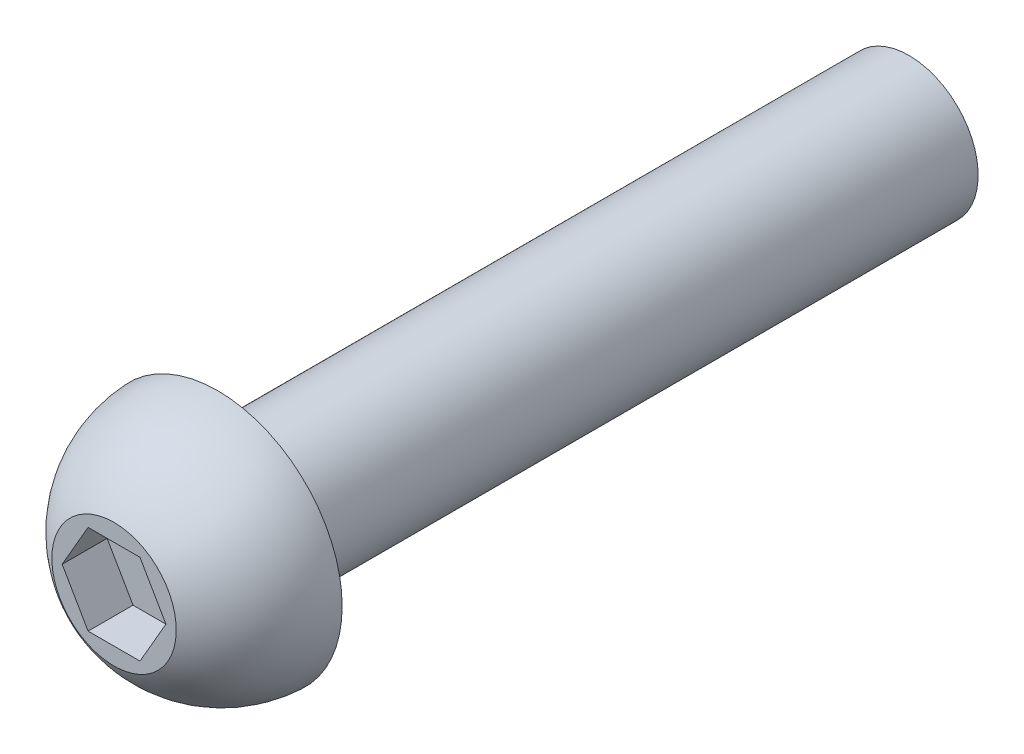
ISO-10303-21;
HEADER;
FILE_DESCRIPTION(('STEP AP214'),'2;1');
FILE_NAME('part.step','',(''),(''),'','','');
FILE_SCHEMA(('AUTOMOTIVE_DESIGN { 1 0 10303 214 1 1 1 1 }'));
ENDSEC;
DATA;
#1=APPLICATION_CONTEXT('core data for automotive mechanical design processes');
#2=APPLICATION_PROTOCOL_DEFINITION('international standard','automotive_design',2000,#1);
#3=PRODUCT_CONTEXT('',#1,'mechanical');
#4=PRODUCT('Part','Part','',(#3));
#5=PRODUCT_RELATED_PRODUCT_CATEGORY('part','',(#4));
#6=PRODUCT_DEFINITION_FORMATION('','',#4);
#7=PRODUCT_DEFINITION_CONTEXT('part definition',#1,'design');
#8=PRODUCT_DEFINITION('design','',#6,#7);
#9=PRODUCT_DEFINITION_SHAPE('','',#8);
#10=(LENGTH_UNIT() NAMED_UNIT(*) SI_UNIT(.MILLI.,.METRE.));
#11=(NAMED_UNIT(*) PLANE_ANGLE_UNIT() SI_UNIT($,.RADIAN.));
#12=(NAMED_UNIT(*) SI_UNIT($,.STERADIAN.) SOLID_ANGLE_UNIT());
#13=UNCERTAINTY_MEASURE_WITH_UNIT(LENGTH_MEASURE(1.E-05),#10,'distance_accuracy_value','');
#14=(GEOMETRIC_REPRESENTATION_CONTEXT(3) GLOBAL_UNCERTAINTY_ASSIGNED_CONTEXT((#13)) GLOBAL_UNIT_ASSIGNED_CONTEXT((#10,
#11,#12)) REPRESENTATION_CONTEXT('',''));
#15=CARTESIAN_POINT('',(0.,0.,0.));
#16=DIRECTION('',(0.,0.,1.));
#17=DIRECTION('',(1.,0.,0.));
#18=AXIS2_PLACEMENT_3D('',#15,#16,#17);
#19=CARTESIAN_POINT('',(0.,0.,0.));
#20=DIRECTION('',(0.,0.,1.));
#21=DIRECTION('',(1.,0.,0.));
#22=AXIS2_PLACEMENT_3D('',#19,#20,#21);
#23=PLANE('',#22);
#24=DIRECTION('',(0.5,0.866025403784439,0.));
#25=VECTOR('',#24,1.);
#26=CARTESIAN_POINT('',(0.375277674973258,-0.65,0.));
#27=LINE('',#26,#25);
#28=CARTESIAN_POINT('',(0.375277674973258,-0.65,0.));
#29=VERTEX_POINT('',#28);
#30=CARTESIAN_POINT('',(0.750555349946514,0.,0.));
#31=VERTEX_POINT('',#30);
#32=EDGE_CURVE('E52',#29,#31,#27,.T.);
#33=ORIENTED_EDGE('',*,*,#32,.F.);
#34=DIRECTION('',(1.,0.,0.));
#35=VECTOR('',#34,1.);
#36=CARTESIAN_POINT('',(-0.375277674973257,-0.65,0.));
#37=LINE('',#36,#35);
#38=CARTESIAN_POINT('',(-0.375277674973257,-0.65,0.));
#39=VERTEX_POINT('',#38);
#40=EDGE_CURVE('E135',#39,#29,#37,.T.);
#41=ORIENTED_EDGE('',*,*,#40,.F.);
#42=DIRECTION('',(0.5,-0.866025403784438,0.));
#43=VECTOR('',#42,1.);
#44=CARTESIAN_POINT('',(-0.750555349946514,0.,0.));
#45=LINE('',#44,#43);
#46=CARTESIAN_POINT('',(-0.750555349946514,0.,0.));
#47=VERTEX_POINT('',#46);
#48=EDGE_CURVE('E133',#47,#39,#45,.T.);
#49=ORIENTED_EDGE('',*,*,#48,.F.);
#50=DIRECTION('',(-0.5,-0.866025403784438,0.));
#51=VECTOR('',#50,1.);
#52=CARTESIAN_POINT('',(-0.375277674973257,0.65,0.));
#53=LINE('',#52,#51);
#54=CARTESIAN_POINT('',(-0.375277674973257,0.65,0.));
#55=VERTEX_POINT('',#54);
#56=EDGE_CURVE('E100',#55,#47,#53,.T.);
#57=ORIENTED_EDGE('',*,*,#56,.F.);
#58=DIRECTION('',(-1.,0.,0.));
#59=VECTOR('',#58,1.);
#60=CARTESIAN_POINT('',(0.375277674973256,0.65,0.));
#61=LINE('',#60,#59);
#62=CARTESIAN_POINT('',(0.375277674973256,0.65,0.));
#63=VERTEX_POINT('',#62);
#64=EDGE_CURVE('E129',#63,#55,#61,.T.);
#65=ORIENTED_EDGE('',*,*,#64,.F.);
#66=DIRECTION('',(-0.5,0.866025403784438,0.));
#67=VECTOR('',#66,1.);
#68=CARTESIAN_POINT('',(0.750555349946514,0.,0.));
#69=LINE('',#68,#67);
#70=EDGE_CURVE('E126',#31,#63,#69,.T.);
#71=ORIENTED_EDGE('',*,*,#70,.F.);
#72=EDGE_LOOP('',(#33,#41,#49,#57,#65,#71));
#73=FACE_BOUND('',#72,.T.);
#74=CARTESIAN_POINT('',(0.,0.,0.));
#75=DIRECTION('',(0.,0.,-1.));
#76=DIRECTION('',(-1.,0.,0.));
#77=AXIS2_PLACEMENT_3D('',#74,#75,#76);
#78=CIRCLE('',#77,0.9);
#79=CARTESIAN_POINT('',(0.,0.9,0.));
#80=VERTEX_POINT('',#79);
#81=EDGE_CURVE('E11',#80,#80,#78,.T.);
#82=ORIENTED_EDGE('',*,*,#81,.F.);
#83=EDGE_LOOP('',(#82));
#84=FACE_BOUND('',#83,.T.);
#85=ADVANCED_FACE('F38',(#73,#84),#23,.T.);
#86=CARTESIAN_POINT('',(0.,0.,-1.56));
#87=DIRECTION('',(0.,0.,-1.));
#88=DIRECTION('',(0.,1.,0.));
#89=AXIS2_PLACEMENT_3D('',#86,#87,#88);
#90=SPHERICAL_SURFACE('',#89,1.80099972237644);
#91=CARTESIAN_POINT('',(0.,0.,-1.5));
#92=DIRECTION('',(0.,0.,-1.));
#93=DIRECTION('',(-1.,0.,0.));
#94=AXIS2_PLACEMENT_3D('',#91,#92,#93);
#95=CIRCLE('',#94,1.8);
#96=CARTESIAN_POINT('',(0.,1.8,-1.5));
#97=VERTEX_POINT('',#96);
#98=EDGE_CURVE('E45',#97,#97,#95,.T.);
#99=CARTESIAN_POINT('',(0.,0.9,0.));
#100=CARTESIAN_POINT('',(0.,0.916480758610529,-0.00950800446338882));
#101=CARTESIAN_POINT('',(0.,0.932810732164473,-0.0192773577456245));
#102=CARTESIAN_POINT('',(0.,0.965152958953574,-0.039328543612785));
#103=CARTESIAN_POINT('',(0.,0.981165212188732,-0.0496103761977099));
#104=CARTESIAN_POINT('',(0.,1.01285584813464,-0.0706763023352447));
#105=CARTESIAN_POINT('',(0.,1.02853423084539,-0.0814603958878545));
#106=CARTESIAN_POINT('',(0.,1.0595413963855,-0.103519983229803));
#107=CARTESIAN_POINT('',(0.,1.07487017921485,-0.114795477019142));
#108=CARTESIAN_POINT('',(0.,1.10516274386287,-0.137826547495728));
#109=CARTESIAN_POINT('',(0.,1.12012652568153,-0.149582124182975));
#110=CARTESIAN_POINT('',(0.,1.14967405992645,-0.173561551017041));
#111=CARTESIAN_POINT('',(0.,1.1642578123527,-0.185785401163861));
#112=CARTESIAN_POINT('',(0.,1.19303063948906,-0.210689097796453));
#113=CARTESIAN_POINT('',(0.,1.20721971419916,-0.223368944282225));
#114=CARTESIAN_POINT('',(0.,1.23518893443603,-0.24917189775669));
#115=CARTESIAN_POINT('',(0.,1.2489690799628,-0.262295004745383));
#116=CARTESIAN_POINT('',(0.,1.27610660097774,-0.288971298367635));
#117=CARTESIAN_POINT('',(0.,1.28946397646591,-0.302524485001193));
#118=CARTESIAN_POINT('',(0.,1.31574254121186,-0.330047325030452));
#119=CARTESIAN_POINT('',(0.,1.32866373046964,-0.344016978426152));
#120=CARTESIAN_POINT('',(0.,1.35405694466164,-0.372358720809857));
#121=CARTESIAN_POINT('',(0.,1.36652896959585,-0.386730809797862));
#122=CARTESIAN_POINT('',(0.,1.39101132819216,-0.415862987984842));
#123=CARTESIAN_POINT('',(0.,1.40302166185426,-0.430623077183817));
#124=CARTESIAN_POINT('',(0.,1.42656857468163,-0.460516430703506));
#125=CARTESIAN_POINT('',(0.,1.43810515384691,-0.475649695024219));
#126=CARTESIAN_POINT('',(0.,1.4606929702969,-0.506274198879386));
#127=CARTESIAN_POINT('',(0.,1.47174420758163,-0.521765438413838));
#128=CARTESIAN_POINT('',(0.,1.49335024036597,-0.553090333236895));
#129=CARTESIAN_POINT('',(0.,1.50390503586559,-0.568923988525498));
#130=CARTESIAN_POINT('',(0.,1.52450758380319,-0.600917811473571));
#131=CARTESIAN_POINT('',(0.,1.53455533624117,-0.61707797913304));
#132=CARTESIAN_POINT('',(0.,1.55413370605493,-0.6497085954893));
#133=CARTESIAN_POINT('',(0.,1.5636643234307,-0.666179044186093));
#134=CARTESIAN_POINT('',(0.,1.5821988505319,-0.699413679636009));
#135=CARTESIAN_POINT('',(0.,1.59120276025731,-0.716177866389134));
#136=CARTESIAN_POINT('',(0.,1.60867482849679,-0.74998313993911));
#137=CARTESIAN_POINT('',(0.,1.61714298701085,-0.767024226735961));
#138=CARTESIAN_POINT('',(0.,1.63353504737717,-0.801366184241332));
#139=CARTESIAN_POINT('',(0.,1.64145894922944,-0.818667054949852));
#140=CARTESIAN_POINT('',(0.,1.65675453747511,-0.853511203218563));
#141=CARTESIAN_POINT('',(0.,1.66412622386851,-0.871054480778754));
#142=CARTESIAN_POINT('',(0.,1.67830997704699,-0.906365822216432));
#143=CARTESIAN_POINT('',(0.,1.68512204383207,-0.924133886093918));
#144=CARTESIAN_POINT('',(0.,1.69817971572734,-0.959876953855656));
#145=CARTESIAN_POINT('',(0.,1.70442532083754,-0.977851957739909));
#146=CARTESIAN_POINT('',(0.,1.71634379627702,-1.01399085135305));
#147=CARTESIAN_POINT('',(0.,1.72201666660632,-1.03215474108193));
#148=CARTESIAN_POINT('',(0.,1.73278397461892,-1.06865316250558));
#149=CARTESIAN_POINT('',(0.,1.73787841230223,-1.08698769420035));
#150=CARTESIAN_POINT('',(0.,1.74748373819764,-1.12380898427969));
#151=CARTESIAN_POINT('',(0.,1.75199462640975,-1.14229574266427));
#152=CARTESIAN_POINT('',(0.,1.76042832243316,-1.17940291796462));
#153=CARTESIAN_POINT('',(0.,1.76435113024447,-1.19802333488041));
#154=CARTESIAN_POINT('',(0.,1.77160472604163,-1.23537912478313));
#155=CARTESIAN_POINT('',(0.,1.77493551402747,-1.25411449777007));
#156=CARTESIAN_POINT('',(0.,1.78100172226069,-1.29168138209553));
#157=CARTESIAN_POINT('',(0.,1.78373714250805,-1.31051289343407));
#158=CARTESIAN_POINT('',(0.,1.78860987696737,-1.34825313942449));
#159=CARTESIAN_POINT('',(0.,1.79074719117932,-1.36716187407638));
#160=CARTESIAN_POINT('',(0.,1.79442153262025,-1.4050375769169));
#161=CARTESIAN_POINT('',(0.,1.79595855984922,-1.42400454510554));
#162=CARTESIAN_POINT('',(0.,1.79843091124302,-1.46197765620988));
#163=CARTESIAN_POINT('',(0.,1.79936623540785,-1.48098379912559));
#164=CARTESIAN_POINT('',(0.,1.8,-1.5));
#165=B_SPLINE_CURVE_WITH_KNOTS('',3,(#99,#100,#101,#102,#103,#104,#105,#106,#107,#108,#109,#110,
#111,#112,#113,#114,#115,#116,#117,#118,#119,#120,#121,#122,#123,#124,#125,#126,#127,#128,#129,
#130,#131,#132,#133,#134,#135,#136,#137,#138,#139,#140,#141,#142,#143,#144,#145,#146,#147,#148,
#149,#150,#151,#152,#153,#154,#155,#156,#157,#158,#159,#160,#161,#162,#163,#164),.UNSPECIFIED.,
.F.,.F.,(4,2,2,2,2,2,2,2,2,2,2,2,2,2,2,2,2,2,2,2,2,2,2,2,2,2,2,2,2,2,2,2,4),(0.,
0.0570778776136254,0.11415575522725,0.171233632840876,0.228311510454501,0.285389388068126,
0.342467265681752,0.399545143295376,0.456623020909002,0.513700898522627,0.570778776136252,
0.627856653749878,0.684934531363503,0.742012408977128,0.799090286590753,0.856168164204379,
0.913246041818004,0.970323919431629,1.02740179704525,1.08447967465888,1.1415575522725,
1.19863542988613,1.25571330749976,1.31279118511338,1.36986906272701,1.42694694034063,
1.48402481795426,1.54110269556788,1.59818057318151,1.65525845079513,1.71233632840876,
1.76941420602238,1.82649208363601),.UNSPECIFIED.);
#166=EDGE_CURVE('BSEAM155',#80,#97,#165,.T.);
#167=ORIENTED_EDGE('',*,*,#81,.T.);
#168=ORIENTED_EDGE('',*,*,#98,.F.);
#169=ORIENTED_EDGE('',*,*,#166,.T.);
#170=ORIENTED_EDGE('',*,*,#166,.F.);
#171=EDGE_LOOP('',(#167,#169,#168,#170));
#172=FACE_BOUND('',#171,.T.);
#173=ADVANCED_FACE('F155',(#172),#90,.T.);
#174=CARTESIAN_POINT('',(0.,1.8,-1.5));
#175=DIRECTION('',(0.,0.,-1.));
#176=DIRECTION('',(-1.,0.,0.));
#177=AXIS2_PLACEMENT_3D('',#174,#175,#176);
#178=PLANE('',#177);
#179=ORIENTED_EDGE('',*,*,#98,.T.);
#180=EDGE_LOOP('',(#179));
#181=FACE_BOUND('',#180,.T.);
#182=CARTESIAN_POINT('',(0.,0.,-1.5));
#183=DIRECTION('',(0.,0.,-1.));
#184=DIRECTION('',(-1.,0.,0.));
#185=AXIS2_PLACEMENT_3D('',#182,#183,#184);
#186=CIRCLE('',#185,1.);
#187=CARTESIAN_POINT('',(-1.,0.,-1.5));
#188=VERTEX_POINT('',#187);
#189=EDGE_CURVE('E147',#188,#188,#186,.T.);
#190=ORIENTED_EDGE('',*,*,#189,.F.);
#191=EDGE_LOOP('',(#190));
#192=FACE_BOUND('',#191,.T.);
#193=ADVANCED_FACE('F152',(#181,#192),#178,.T.);
#194=CARTESIAN_POINT('',(0.,0.,0.));
#195=DIRECTION('',(0.,0.,-1.));
#196=DIRECTION('',(-1.,0.,0.));
#197=AXIS2_PLACEMENT_3D('',#194,#195,#196);
#198=CYLINDRICAL_SURFACE('',#197,1.);
#199=ORIENTED_EDGE('',*,*,#189,.T.);
#200=EDGE_LOOP('',(#199));
#201=FACE_BOUND('',#200,.T.);
#202=CARTESIAN_POINT('',(0.,0.,-11.5));
#203=DIRECTION('',(0.,0.,-1.));
#204=DIRECTION('',(-1.,0.,0.));
#205=AXIS2_PLACEMENT_3D('',#202,#203,#204);
#206=CIRCLE('',#205,1.);
#207=CARTESIAN_POINT('',(-1.,0.,-11.5));
#208=VERTEX_POINT('',#207);
#209=EDGE_CURVE('E139',#208,#208,#206,.T.);
#210=ORIENTED_EDGE('',*,*,#209,.F.);
#211=EDGE_LOOP('',(#210));
#212=FACE_BOUND('',#211,.T.);
#213=ADVANCED_FACE('F162',(#201,#212),#198,.T.);
#214=CARTESIAN_POINT('',(0.,1.,-11.5));
#215=DIRECTION('',(0.,0.,-1.));
#216=DIRECTION('',(-1.,0.,0.));
#217=AXIS2_PLACEMENT_3D('',#214,#215,#216);
#218=PLANE('',#217);
#219=ORIENTED_EDGE('',*,*,#209,.T.);
#220=EDGE_LOOP('',(#219));
#221=FACE_BOUND('',#220,.T.);
#222=ADVANCED_FACE('F168',(#221),#218,.T.);
#223=CARTESIAN_POINT('',(0.375277674973258,-0.65,-0.65));
#224=DIRECTION('',(0.866025403784439,-0.5,0.));
#225=DIRECTION('',(0.5,0.866025403784439,0.));
#226=AXIS2_PLACEMENT_3D('',#223,#224,#225);
#227=PLANE('',#226);
#228=ORIENTED_EDGE('',*,*,#32,.T.);
#229=DIRECTION('',(0.,0.,1.));
#230=VECTOR('',#229,1.);
#231=CARTESIAN_POINT('',(0.750555349946514,0.,-0.65));
#232=LINE('',#231,#230);
#233=CARTESIAN_POINT('',(0.750555349946514,0.,-0.65));
#234=VERTEX_POINT('',#233);
#235=EDGE_CURVE('E82',#234,#31,#232,.T.);
#236=ORIENTED_EDGE('',*,*,#235,.F.);
#237=DIRECTION('',(0.5,0.866025403784439,0.));
#238=VECTOR('',#237,1.);
#239=CARTESIAN_POINT('',(0.375277674973258,-0.65,-0.65));
#240=LINE('',#239,#238);
#241=CARTESIAN_POINT('',(0.375277674973258,-0.65,-0.65));
#242=VERTEX_POINT('',#241);
#243=EDGE_CURVE('E137',#242,#234,#240,.T.);
#244=ORIENTED_EDGE('',*,*,#243,.F.);
#245=DIRECTION('',(0.,0.,1.));
#246=VECTOR('',#245,1.);
#247=CARTESIAN_POINT('',(0.375277674973258,-0.65,-0.65));
#248=LINE('',#247,#246);
#249=EDGE_CURVE('E60',#242,#29,#248,.T.);
#250=ORIENTED_EDGE('',*,*,#249,.T.);
#251=EDGE_LOOP('',(#228,#236,#244,#250));
#252=FACE_BOUND('',#251,.T.);
#253=ADVANCED_FACE('F172',(#252),#227,.F.);
#254=CARTESIAN_POINT('',(-0.375277674973257,-0.65,-0.65));
#255=DIRECTION('',(0.,-1.,0.));
#256=DIRECTION('',(1.,0.,0.));
#257=AXIS2_PLACEMENT_3D('',#254,#255,#256);
#258=PLANE('',#257);
#259=ORIENTED_EDGE('',*,*,#40,.T.);
#260=ORIENTED_EDGE('',*,*,#249,.F.);
#261=DIRECTION('',(1.,0.,0.));
#262=VECTOR('',#261,1.);
#263=CARTESIAN_POINT('',(-0.375277674973257,-0.65,-0.65));
#264=LINE('',#263,#262);
#265=CARTESIAN_POINT('',(-0.375277674973257,-0.65,-0.65));
#266=VERTEX_POINT('',#265);
#267=EDGE_CURVE('E112',#266,#242,#264,.T.);
#268=ORIENTED_EDGE('',*,*,#267,.F.);
#269=DIRECTION('',(0.,0.,1.));
#270=VECTOR('',#269,1.);
#271=CARTESIAN_POINT('',(-0.375277674973257,-0.65,-0.65));
#272=LINE('',#271,#270);
#273=EDGE_CURVE('E104',#266,#39,#272,.T.);
#274=ORIENTED_EDGE('',*,*,#273,.T.);
#275=EDGE_LOOP('',(#259,#260,#268,#274));
#276=FACE_BOUND('',#275,.T.);
#277=ADVANCED_FACE('F176',(#276),#258,.F.);
#278=CARTESIAN_POINT('',(-0.750555349946514,0.,-0.65));
#279=DIRECTION('',(-0.866025403784438,-0.5,0.));
#280=DIRECTION('',(0.5,-0.866025403784439,0.));
#281=AXIS2_PLACEMENT_3D('',#278,#279,#280);
#282=PLANE('',#281);
#283=ORIENTED_EDGE('',*,*,#48,.T.);
#284=ORIENTED_EDGE('',*,*,#273,.F.);
#285=DIRECTION('',(0.5,-0.866025403784438,0.));
#286=VECTOR('',#285,1.);
#287=CARTESIAN_POINT('',(-0.750555349946514,0.,-0.65));
#288=LINE('',#287,#286);
#289=CARTESIAN_POINT('',(-0.750555349946514,0.,-0.65));
#290=VERTEX_POINT('',#289);
#291=EDGE_CURVE('E108',#290,#266,#288,.T.);
#292=ORIENTED_EDGE('',*,*,#291,.F.);
#293=DIRECTION('',(0.,0.,1.));
#294=VECTOR('',#293,1.);
#295=CARTESIAN_POINT('',(-0.750555349946514,0.,-0.65));
#296=LINE('',#295,#294);
#297=EDGE_CURVE('E93',#290,#47,#296,.T.);
#298=ORIENTED_EDGE('',*,*,#297,.T.);
#299=EDGE_LOOP('',(#283,#284,#292,#298));
#300=FACE_BOUND('',#299,.T.);
#301=ADVANCED_FACE('F109',(#300),#282,.F.);
#302=CARTESIAN_POINT('',(-0.375277674973257,0.65,-0.65));
#303=DIRECTION('',(-0.866025403784438,0.5,0.));
#304=DIRECTION('',(-0.5,-0.866025403784439,0.));
#305=AXIS2_PLACEMENT_3D('',#302,#303,#304);
#306=PLANE('',#305);
#307=ORIENTED_EDGE('',*,*,#56,.T.);
#308=ORIENTED_EDGE('',*,*,#297,.F.);
#309=DIRECTION('',(-0.5,-0.866025403784438,0.));
#310=VECTOR('',#309,1.);
#311=CARTESIAN_POINT('',(-0.375277674973257,0.65,-0.65));
#312=LINE('',#311,#310);
#313=CARTESIAN_POINT('',(-0.375277674973257,0.65,-0.65));
#314=VERTEX_POINT('',#313);
#315=EDGE_CURVE('E97',#314,#290,#312,.T.);
#316=ORIENTED_EDGE('',*,*,#315,.F.);
#317=DIRECTION('',(0.,0.,1.));
#318=VECTOR('',#317,1.);
#319=CARTESIAN_POINT('',(-0.375277674973257,0.65,-0.65));
#320=LINE('',#319,#318);
#321=EDGE_CURVE('E105',#314,#55,#320,.T.);
#322=ORIENTED_EDGE('',*,*,#321,.T.);
#323=EDGE_LOOP('',(#307,#308,#316,#322));
#324=FACE_BOUND('',#323,.T.);
#325=ADVANCED_FACE('F95',(#324),#306,.F.);
#326=CARTESIAN_POINT('',(0.375277674973256,0.65,-0.65));
#327=DIRECTION('',(0.,1.,0.));
#328=DIRECTION('',(0.,0.,1.));
#329=AXIS2_PLACEMENT_3D('',#326,#327,#328);
#330=PLANE('',#329);
#331=ORIENTED_EDGE('',*,*,#64,.T.);
#332=ORIENTED_EDGE('',*,*,#321,.F.);
#333=DIRECTION('',(-1.,0.,0.));
#334=VECTOR('',#333,1.);
#335=CARTESIAN_POINT('',(0.375277674973256,0.65,-0.65));
#336=LINE('',#335,#334);
#337=CARTESIAN_POINT('',(0.375277674973256,0.65,-0.65));
#338=VERTEX_POINT('',#337);
#339=EDGE_CURVE('E118',#338,#314,#336,.T.);
#340=ORIENTED_EDGE('',*,*,#339,.F.);
#341=DIRECTION('',(0.,0.,1.));
#342=VECTOR('',#341,1.);
#343=CARTESIAN_POINT('',(0.375277674973256,0.65,-0.65));
#344=LINE('',#343,#342);
#345=EDGE_CURVE('E142',#338,#63,#344,.T.);
#346=ORIENTED_EDGE('',*,*,#345,.T.);
#347=EDGE_LOOP('',(#331,#332,#340,#346));
#348=FACE_BOUND('',#347,.T.);
#349=ADVANCED_FACE('F180',(#348),#330,.F.);
#350=CARTESIAN_POINT('',(0.750555349946514,0.,-0.65));
#351=DIRECTION('',(0.866025403784438,0.5,0.));
#352=DIRECTION('',(-0.5,0.866025403784439,0.));
#353=AXIS2_PLACEMENT_3D('',#350,#351,#352);
#354=PLANE('',#353);
#355=ORIENTED_EDGE('',*,*,#70,.T.);
#356=ORIENTED_EDGE('',*,*,#345,.F.);
#357=DIRECTION('',(-0.5,0.866025403784438,0.));
#358=VECTOR('',#357,1.);
#359=CARTESIAN_POINT('',(0.750555349946514,0.,-0.65));
#360=LINE('',#359,#358);
#361=EDGE_CURVE('E120',#234,#338,#360,.T.);
#362=ORIENTED_EDGE('',*,*,#361,.F.);
#363=ORIENTED_EDGE('',*,*,#235,.T.);
#364=EDGE_LOOP('',(#355,#356,#362,#363));
#365=FACE_BOUND('',#364,.T.);
#366=ADVANCED_FACE('F177',(#365),#354,.F.);
#367=CARTESIAN_POINT('',(0.,0.,-0.65));
#368=DIRECTION('',(0.,0.,1.));
#369=DIRECTION('',(1.,0.,0.));
#370=AXIS2_PLACEMENT_3D('',#367,#368,#369);
#371=PLANE('',#370);
#372=ORIENTED_EDGE('',*,*,#243,.T.);
#373=ORIENTED_EDGE('',*,*,#361,.T.);
#374=ORIENTED_EDGE('',*,*,#339,.T.);
#375=ORIENTED_EDGE('',*,*,#315,.T.);
#376=ORIENTED_EDGE('',*,*,#291,.T.);
#377=ORIENTED_EDGE('',*,*,#267,.T.);
#378=EDGE_LOOP('',(#372,#373,#374,#375,#376,#377));
#379=FACE_BOUND('',#378,.T.);
#380=ADVANCED_FACE('F115',(#379),#371,.T.);
#381=CLOSED_SHELL('',(#85,#173,#193,#213,#222,#253,#277,#301,#325,#349,#366,#380));
#382=MANIFOLD_SOLID_BREP('B2',#381);
#383=ADVANCED_BREP_SHAPE_REPRESENTATION('',(#18,#382),#14);
#384=SHAPE_DEFINITION_REPRESENTATION(#9,#383);
ENDSEC;
END-ISO-10303-21;
